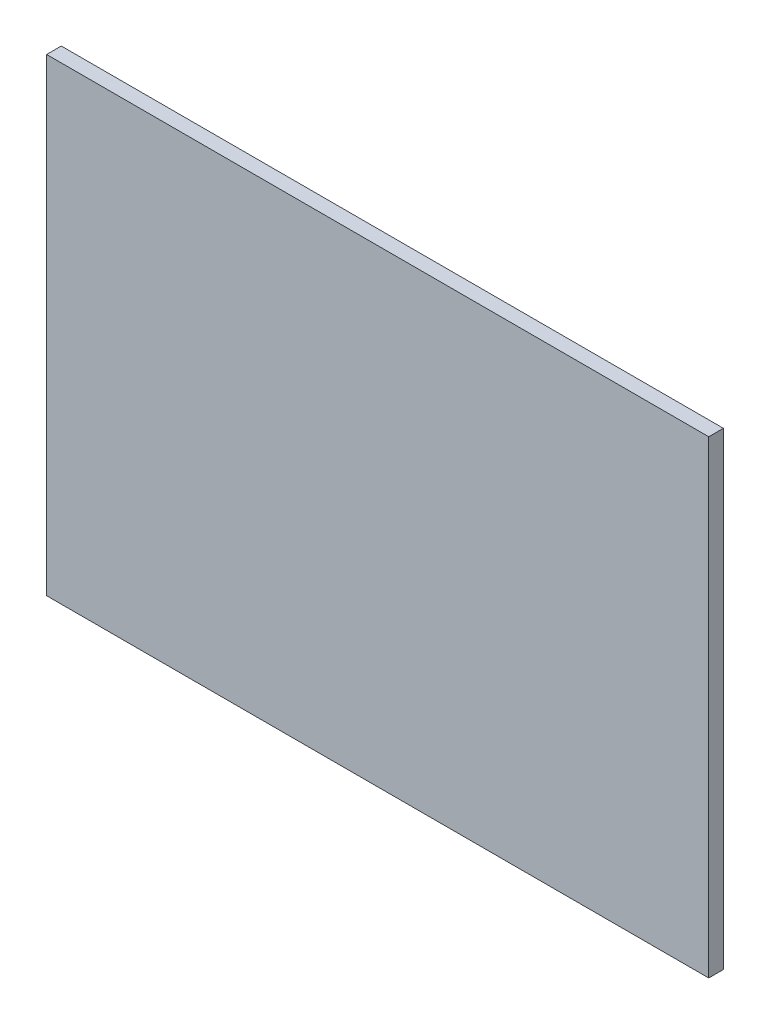
ISO-10303-21;
HEADER;
FILE_DESCRIPTION(('STEP AP214'),'2;1');
FILE_NAME('part.step','',(''),(''),'','','');
FILE_SCHEMA(('AUTOMOTIVE_DESIGN { 1 0 10303 214 1 1 1 1 }'));
ENDSEC;
DATA;
#1=APPLICATION_CONTEXT('core data for automotive mechanical design processes');
#2=APPLICATION_PROTOCOL_DEFINITION('international standard','automotive_design',2000,#1);
#3=PRODUCT_CONTEXT('',#1,'mechanical');
#4=PRODUCT('Part','Part','',(#3));
#5=PRODUCT_RELATED_PRODUCT_CATEGORY('part','',(#4));
#6=PRODUCT_DEFINITION_FORMATION('','',#4);
#7=PRODUCT_DEFINITION_CONTEXT('part definition',#1,'design');
#8=PRODUCT_DEFINITION('design','',#6,#7);
#9=PRODUCT_DEFINITION_SHAPE('','',#8);
#10=(LENGTH_UNIT() NAMED_UNIT(*) SI_UNIT(.MILLI.,.METRE.));
#11=(NAMED_UNIT(*) PLANE_ANGLE_UNIT() SI_UNIT($,.RADIAN.));
#12=(NAMED_UNIT(*) SI_UNIT($,.STERADIAN.) SOLID_ANGLE_UNIT());
#13=UNCERTAINTY_MEASURE_WITH_UNIT(LENGTH_MEASURE(1.E-05),#10,'distance_accuracy_value','');
#14=(GEOMETRIC_REPRESENTATION_CONTEXT(3) GLOBAL_UNCERTAINTY_ASSIGNED_CONTEXT((#13)) GLOBAL_UNIT_ASSIGNED_CONTEXT((#10,
#11,#12)) REPRESENTATION_CONTEXT('',''));
#15=CARTESIAN_POINT('',(0.,0.,0.));
#16=DIRECTION('',(0.,0.,1.));
#17=DIRECTION('',(1.,0.,0.));
#18=AXIS2_PLACEMENT_3D('',#15,#16,#17);
#19=CARTESIAN_POINT('',(-143.51,-101.6,3.175));
#20=DIRECTION('',(-1.,0.,0.));
#21=DIRECTION('',(0.,0.,1.));
#22=AXIS2_PLACEMENT_3D('',#19,#20,#21);
#23=PLANE('',#22);
#24=DIRECTION('',(0.,1.,0.));
#25=VECTOR('',#24,1.);
#26=CARTESIAN_POINT('',(-143.51,-101.6,-3.175));
#27=LINE('',#26,#25);
#28=CARTESIAN_POINT('',(-143.51,-101.6,-3.175));
#29=VERTEX_POINT('',#28);
#30=CARTESIAN_POINT('',(-143.51,101.6,-3.175));
#31=VERTEX_POINT('',#30);
#32=EDGE_CURVE('E102',#29,#31,#27,.T.);
#33=ORIENTED_EDGE('',*,*,#32,.F.);
#34=DIRECTION('',(0.,0.,-1.));
#35=VECTOR('',#34,1.);
#36=CARTESIAN_POINT('',(-143.51,-101.6,3.175));
#37=LINE('',#36,#35);
#38=CARTESIAN_POINT('',(-143.51,-101.6,3.175));
#39=VERTEX_POINT('',#38);
#40=EDGE_CURVE('E11',#39,#29,#37,.T.);
#41=ORIENTED_EDGE('',*,*,#40,.F.);
#42=DIRECTION('',(0.,1.,0.));
#43=VECTOR('',#42,1.);
#44=CARTESIAN_POINT('',(-143.51,-101.6,3.175));
#45=LINE('',#44,#43);
#46=CARTESIAN_POINT('',(-143.51,101.6,3.175));
#47=VERTEX_POINT('',#46);
#48=EDGE_CURVE('E97',#39,#47,#45,.T.);
#49=ORIENTED_EDGE('',*,*,#48,.T.);
#50=DIRECTION('',(0.,0.,-1.));
#51=VECTOR('',#50,1.);
#52=CARTESIAN_POINT('',(-143.51,101.6,3.175));
#53=LINE('',#52,#51);
#54=EDGE_CURVE('E40',#47,#31,#53,.T.);
#55=ORIENTED_EDGE('',*,*,#54,.T.);
#56=EDGE_LOOP('',(#33,#41,#49,#55));
#57=FACE_BOUND('',#56,.T.);
#58=ADVANCED_FACE('F37',(#57),#23,.T.);
#59=CARTESIAN_POINT('',(-143.51,-101.6,3.175));
#60=DIRECTION('',(0.,1.,0.));
#61=DIRECTION('',(0.,0.,1.));
#62=AXIS2_PLACEMENT_3D('',#59,#60,#61);
#63=PLANE('',#62);
#64=DIRECTION('',(1.,0.,0.));
#65=VECTOR('',#64,1.);
#66=CARTESIAN_POINT('',(-143.51,-101.6,-3.175));
#67=LINE('',#66,#65);
#68=CARTESIAN_POINT('',(143.51,-101.6,-3.175));
#69=VERTEX_POINT('',#68);
#70=EDGE_CURVE('E70',#29,#69,#67,.T.);
#71=ORIENTED_EDGE('',*,*,#70,.T.);
#72=DIRECTION('',(0.,0.,-1.));
#73=VECTOR('',#72,1.);
#74=CARTESIAN_POINT('',(143.51,-101.6,3.175));
#75=LINE('',#74,#73);
#76=CARTESIAN_POINT('',(143.51,-101.6,3.175));
#77=VERTEX_POINT('',#76);
#78=EDGE_CURVE('E46',#77,#69,#75,.T.);
#79=ORIENTED_EDGE('',*,*,#78,.F.);
#80=DIRECTION('',(1.,0.,0.));
#81=VECTOR('',#80,1.);
#82=CARTESIAN_POINT('',(-143.51,-101.6,3.175));
#83=LINE('',#82,#81);
#84=EDGE_CURVE('E87',#39,#77,#83,.T.);
#85=ORIENTED_EDGE('',*,*,#84,.F.);
#86=ORIENTED_EDGE('',*,*,#40,.T.);
#87=EDGE_LOOP('',(#71,#79,#85,#86));
#88=FACE_BOUND('',#87,.T.);
#89=ADVANCED_FACE('F112',(#88),#63,.F.);
#90=CARTESIAN_POINT('',(143.51,-101.6,3.175));
#91=DIRECTION('',(-1.,0.,0.));
#92=DIRECTION('',(0.,0.,1.));
#93=AXIS2_PLACEMENT_3D('',#90,#91,#92);
#94=PLANE('',#93);
#95=DIRECTION('',(0.,1.,0.));
#96=VECTOR('',#95,1.);
#97=CARTESIAN_POINT('',(143.51,-101.6,-3.175));
#98=LINE('',#97,#96);
#99=CARTESIAN_POINT('',(143.51,101.6,-3.175));
#100=VERTEX_POINT('',#99);
#101=EDGE_CURVE('E94',#69,#100,#98,.T.);
#102=ORIENTED_EDGE('',*,*,#101,.T.);
#103=DIRECTION('',(0.,0.,-1.));
#104=VECTOR('',#103,1.);
#105=CARTESIAN_POINT('',(143.51,101.6,3.175));
#106=LINE('',#105,#104);
#107=CARTESIAN_POINT('',(143.51,101.6,3.175));
#108=VERTEX_POINT('',#107);
#109=EDGE_CURVE('E91',#108,#100,#106,.T.);
#110=ORIENTED_EDGE('',*,*,#109,.F.);
#111=DIRECTION('',(0.,1.,0.));
#112=VECTOR('',#111,1.);
#113=CARTESIAN_POINT('',(143.51,-101.6,3.175));
#114=LINE('',#113,#112);
#115=EDGE_CURVE('E82',#77,#108,#114,.T.);
#116=ORIENTED_EDGE('',*,*,#115,.F.);
#117=ORIENTED_EDGE('',*,*,#78,.T.);
#118=EDGE_LOOP('',(#102,#110,#116,#117));
#119=FACE_BOUND('',#118,.T.);
#120=ADVANCED_FACE('F92',(#119),#94,.F.);
#121=CARTESIAN_POINT('',(-143.51,101.6,3.175));
#122=DIRECTION('',(0.,1.,0.));
#123=DIRECTION('',(0.,0.,1.));
#124=AXIS2_PLACEMENT_3D('',#121,#122,#123);
#125=PLANE('',#124);
#126=DIRECTION('',(1.,0.,0.));
#127=VECTOR('',#126,1.);
#128=CARTESIAN_POINT('',(-143.51,101.6,-3.175));
#129=LINE('',#128,#127);
#130=EDGE_CURVE('E105',#31,#100,#129,.T.);
#131=ORIENTED_EDGE('',*,*,#130,.F.);
#132=ORIENTED_EDGE('',*,*,#54,.F.);
#133=DIRECTION('',(1.,0.,0.));
#134=VECTOR('',#133,1.);
#135=CARTESIAN_POINT('',(-143.51,101.6,3.175));
#136=LINE('',#135,#134);
#137=EDGE_CURVE('E86',#47,#108,#136,.T.);
#138=ORIENTED_EDGE('',*,*,#137,.T.);
#139=ORIENTED_EDGE('',*,*,#109,.T.);
#140=EDGE_LOOP('',(#131,#132,#138,#139));
#141=FACE_BOUND('',#140,.T.);
#142=ADVANCED_FACE('F96',(#141),#125,.T.);
#143=CARTESIAN_POINT('',(0.,0.,3.175));
#144=DIRECTION('',(0.,0.,-1.));
#145=DIRECTION('',(-1.,0.,0.));
#146=AXIS2_PLACEMENT_3D('',#143,#144,#145);
#147=PLANE('',#146);
#148=ORIENTED_EDGE('',*,*,#48,.F.);
#149=ORIENTED_EDGE('',*,*,#84,.T.);
#150=ORIENTED_EDGE('',*,*,#115,.T.);
#151=ORIENTED_EDGE('',*,*,#137,.F.);
#152=EDGE_LOOP('',(#148,#149,#150,#151));
#153=FACE_BOUND('',#152,.T.);
#154=ADVANCED_FACE('F85',(#153),#147,.F.);
#155=CARTESIAN_POINT('',(0.,0.,-3.175));
#156=DIRECTION('',(0.,0.,-1.));
#157=DIRECTION('',(-1.,0.,0.));
#158=AXIS2_PLACEMENT_3D('',#155,#156,#157);
#159=PLANE('',#158);
#160=ORIENTED_EDGE('',*,*,#32,.T.);
#161=ORIENTED_EDGE('',*,*,#130,.T.);
#162=ORIENTED_EDGE('',*,*,#101,.F.);
#163=ORIENTED_EDGE('',*,*,#70,.F.);
#164=EDGE_LOOP('',(#160,#161,#162,#163));
#165=FACE_BOUND('',#164,.T.);
#166=ADVANCED_FACE('F110',(#165),#159,.T.);
#167=CLOSED_SHELL('',(#58,#89,#120,#142,#154,#166));
#168=MANIFOLD_SOLID_BREP('B2',#167);
#169=ADVANCED_BREP_SHAPE_REPRESENTATION('',(#18,#168),#14);
#170=SHAPE_DEFINITION_REPRESENTATION(#9,#169);
ENDSEC;
END-ISO-10303-21;
